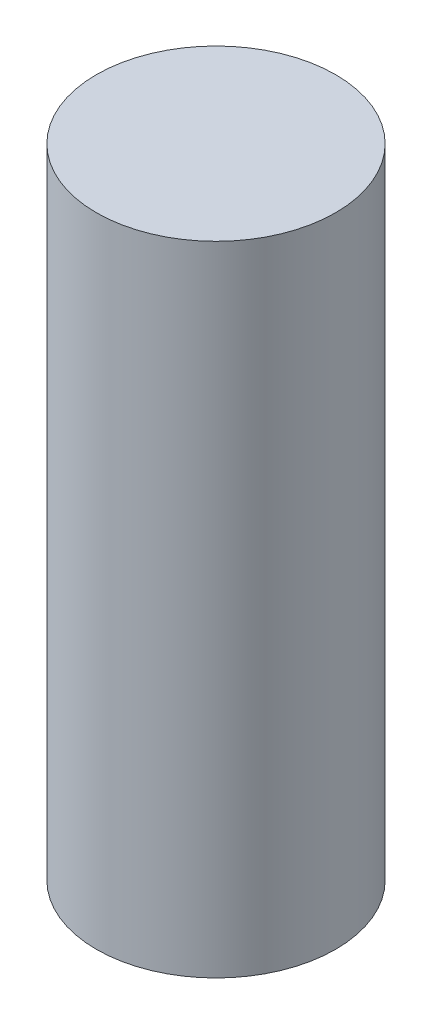
ISO-10303-21;
HEADER;
FILE_DESCRIPTION(('STEP AP214'),'2;1');
FILE_NAME('part.step','',(''),(''),'','','');
FILE_SCHEMA(('AUTOMOTIVE_DESIGN { 1 0 10303 214 1 1 1 1 }'));
ENDSEC;
DATA;
#1=APPLICATION_CONTEXT('core data for automotive mechanical design processes');
#2=APPLICATION_PROTOCOL_DEFINITION('international standard','automotive_design',2000,#1);
#3=PRODUCT_CONTEXT('',#1,'mechanical');
#4=PRODUCT('Part','Part','',(#3));
#5=PRODUCT_RELATED_PRODUCT_CATEGORY('part','',(#4));
#6=PRODUCT_DEFINITION_FORMATION('','',#4);
#7=PRODUCT_DEFINITION_CONTEXT('part definition',#1,'design');
#8=PRODUCT_DEFINITION('design','',#6,#7);
#9=PRODUCT_DEFINITION_SHAPE('','',#8);
#10=(LENGTH_UNIT() NAMED_UNIT(*) SI_UNIT(.MILLI.,.METRE.));
#11=(NAMED_UNIT(*) PLANE_ANGLE_UNIT() SI_UNIT($,.RADIAN.));
#12=(NAMED_UNIT(*) SI_UNIT($,.STERADIAN.) SOLID_ANGLE_UNIT());
#13=UNCERTAINTY_MEASURE_WITH_UNIT(LENGTH_MEASURE(1.E-05),#10,'distance_accuracy_value','');
#14=(GEOMETRIC_REPRESENTATION_CONTEXT(3) GLOBAL_UNCERTAINTY_ASSIGNED_CONTEXT((#13)) GLOBAL_UNIT_ASSIGNED_CONTEXT((#10,
#11,#12)) REPRESENTATION_CONTEXT('',''));
#15=CARTESIAN_POINT('',(0.,0.,0.));
#16=DIRECTION('',(0.,0.,1.));
#17=DIRECTION('',(1.,0.,0.));
#18=AXIS2_PLACEMENT_3D('',#15,#16,#17);
#19=CARTESIAN_POINT('',(0.,16.,0.));
#20=DIRECTION('',(0.,-1.,0.));
#21=DIRECTION('',(0.,0.,-1.));
#22=AXIS2_PLACEMENT_3D('',#19,#20,#21);
#23=CYLINDRICAL_SURFACE('',#22,3.);
#24=CARTESIAN_POINT('',(0.,16.,0.));
#25=DIRECTION('',(0.,1.,0.));
#26=DIRECTION('',(0.,0.,1.));
#27=AXIS2_PLACEMENT_3D('',#24,#25,#26);
#28=CIRCLE('',#27,3.);
#29=CARTESIAN_POINT('',(0.,16.,3.));
#30=VERTEX_POINT('',#29);
#31=EDGE_CURVE('E10',#30,#30,#28,.T.);
#32=ORIENTED_EDGE('',*,*,#31,.F.);
#33=EDGE_LOOP('',(#32));
#34=FACE_BOUND('',#33,.T.);
#35=CARTESIAN_POINT('',(0.,0.,0.));
#36=DIRECTION('',(0.,1.,0.));
#37=DIRECTION('',(0.,0.,1.));
#38=AXIS2_PLACEMENT_3D('',#35,#36,#37);
#39=CIRCLE('',#38,3.);
#40=CARTESIAN_POINT('',(0.,0.,3.));
#41=VERTEX_POINT('',#40);
#42=EDGE_CURVE('E40',#41,#41,#39,.T.);
#43=ORIENTED_EDGE('',*,*,#42,.T.);
#44=EDGE_LOOP('',(#43));
#45=FACE_BOUND('',#44,.T.);
#46=ADVANCED_FACE('F37',(#34,#45),#23,.T.);
#47=CARTESIAN_POINT('',(0.,16.,0.));
#48=DIRECTION('',(0.,1.,0.));
#49=DIRECTION('',(0.,0.,1.));
#50=AXIS2_PLACEMENT_3D('',#47,#48,#49);
#51=PLANE('',#50);
#52=ORIENTED_EDGE('',*,*,#31,.T.);
#53=EDGE_LOOP('',(#52));
#54=FACE_BOUND('',#53,.T.);
#55=ADVANCED_FACE('F54',(#54),#51,.T.);
#56=CARTESIAN_POINT('',(0.,0.,0.));
#57=DIRECTION('',(0.,1.,0.));
#58=DIRECTION('',(0.,0.,1.));
#59=AXIS2_PLACEMENT_3D('',#56,#57,#58);
#60=PLANE('',#59);
#61=ORIENTED_EDGE('',*,*,#42,.F.);
#62=EDGE_LOOP('',(#61));
#63=FACE_BOUND('',#62,.T.);
#64=ADVANCED_FACE('F52',(#63),#60,.F.);
#65=CLOSED_SHELL('',(#46,#55,#64));
#66=MANIFOLD_SOLID_BREP('B2',#65);
#67=ADVANCED_BREP_SHAPE_REPRESENTATION('',(#18,#66),#14);
#68=SHAPE_DEFINITION_REPRESENTATION(#9,#67);
ENDSEC;
END-ISO-10303-21;
